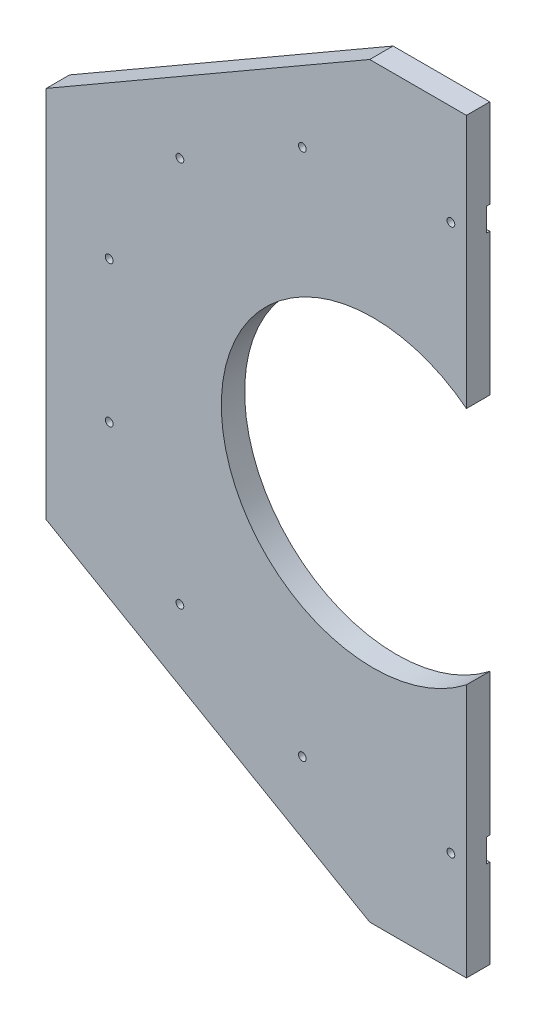
ISO-10303-21;
HEADER;
FILE_DESCRIPTION(('STEP AP214'),'2;1');
FILE_NAME('part.step','',(''),(''),'','','');
FILE_SCHEMA(('AUTOMOTIVE_DESIGN { 1 0 10303 214 1 1 1 1 }'));
ENDSEC;
DATA;
#1=APPLICATION_CONTEXT('core data for automotive mechanical design processes');
#2=APPLICATION_PROTOCOL_DEFINITION('international standard','automotive_design',2000,#1);
#3=PRODUCT_CONTEXT('',#1,'mechanical');
#4=PRODUCT('Part','Part','',(#3));
#5=PRODUCT_RELATED_PRODUCT_CATEGORY('part','',(#4));
#6=PRODUCT_DEFINITION_FORMATION('','',#4);
#7=PRODUCT_DEFINITION_CONTEXT('part definition',#1,'design');
#8=PRODUCT_DEFINITION('design','',#6,#7);
#9=PRODUCT_DEFINITION_SHAPE('','',#8);
#10=(LENGTH_UNIT() NAMED_UNIT(*) SI_UNIT(.MILLI.,.METRE.));
#11=(NAMED_UNIT(*) PLANE_ANGLE_UNIT() SI_UNIT($,.RADIAN.));
#12=(NAMED_UNIT(*) SI_UNIT($,.STERADIAN.) SOLID_ANGLE_UNIT());
#13=UNCERTAINTY_MEASURE_WITH_UNIT(LENGTH_MEASURE(1.E-05),#10,'distance_accuracy_value','');
#14=(GEOMETRIC_REPRESENTATION_CONTEXT(3) GLOBAL_UNCERTAINTY_ASSIGNED_CONTEXT((#13)) GLOBAL_UNIT_ASSIGNED_CONTEXT((#10,
#11,#12)) REPRESENTATION_CONTEXT('',''));
#15=CARTESIAN_POINT('',(0.,0.,0.));
#16=DIRECTION('',(0.,0.,1.));
#17=DIRECTION('',(1.,0.,0.));
#18=AXIS2_PLACEMENT_3D('',#15,#16,#17);
#19=CARTESIAN_POINT('',(0.,0.,0.));
#20=DIRECTION('',(0.,0.,1.));
#21=DIRECTION('',(1.,0.,0.));
#22=AXIS2_PLACEMENT_3D('',#19,#20,#21);
#23=PLANE('',#22);
#24=DIRECTION('',(-0.866025403784439,-0.5,0.));
#25=VECTOR('',#24,1.);
#26=CARTESIAN_POINT('',(-84.4615242270663,146.291651245989,0.));
#27=LINE('',#26,#25);
#28=CARTESIAN_POINT('',(77.8460969082652,240.,0.));
#29=VERTEX_POINT('',#28);
#30=CARTESIAN_POINT('',(-130.,120.,0.));
#31=VERTEX_POINT('',#30);
#32=EDGE_CURVE('E207',#29,#31,#27,.T.);
#33=ORIENTED_EDGE('',*,*,#32,.F.);
#34=DIRECTION('',(-1.,0.,0.));
#35=VECTOR('',#34,1.);
#36=CARTESIAN_POINT('',(0.,240.,0.));
#37=LINE('',#36,#35);
#38=CARTESIAN_POINT('',(140.,240.,0.));
#39=VERTEX_POINT('',#38);
#40=EDGE_CURVE('E187',#39,#29,#37,.T.);
#41=ORIENTED_EDGE('',*,*,#40,.F.);
#42=DIRECTION('',(0.,-1.,0.));
#43=VECTOR('',#42,1.);
#44=CARTESIAN_POINT('',(140.,0.,0.));
#45=LINE('',#44,#43);
#46=CARTESIAN_POINT('',(140.,183.,0.));
#47=VERTEX_POINT('',#46);
#48=EDGE_CURVE('E184',#39,#47,#45,.T.);
#49=ORIENTED_EDGE('',*,*,#48,.T.);
#50=DIRECTION('',(1.,0.,0.));
#51=VECTOR('',#50,1.);
#52=CARTESIAN_POINT('',(0.,183.,0.));
#53=LINE('',#52,#51);
#54=CARTESIAN_POINT('',(79.9999999999999,183.,0.));
#55=VERTEX_POINT('',#54);
#56=EDGE_CURVE('E222',#55,#47,#53,.T.);
#57=ORIENTED_EDGE('',*,*,#56,.F.);
#58=CARTESIAN_POINT('',(79.9999999999999,0.,0.));
#59=DIRECTION('',(0.,0.,1.));
#60=DIRECTION('',(1.,0.,0.));
#61=AXIS2_PLACEMENT_3D('',#58,#59,#60);
#62=CIRCLE('',#61,183.);
#63=CARTESIAN_POINT('',(79.9999999999999,-183.,0.));
#64=VERTEX_POINT('',#63);
#65=EDGE_CURVE('E245',#55,#64,#62,.T.);
#66=ORIENTED_EDGE('',*,*,#65,.T.);
#67=DIRECTION('',(1.,0.,0.));
#68=VECTOR('',#67,1.);
#69=CARTESIAN_POINT('',(0.,-183.,0.));
#70=LINE('',#69,#68);
#71=CARTESIAN_POINT('',(140.,-183.,0.));
#72=VERTEX_POINT('',#71);
#73=EDGE_CURVE('E248',#64,#72,#70,.T.);
#74=ORIENTED_EDGE('',*,*,#73,.T.);
#75=CARTESIAN_POINT('',(140.,-240.,0.));
#76=VERTEX_POINT('',#75);
#77=EDGE_CURVE('E172',#72,#76,#45,.T.);
#78=ORIENTED_EDGE('',*,*,#77,.T.);
#79=DIRECTION('',(-1.,0.,0.));
#80=VECTOR('',#79,1.);
#81=CARTESIAN_POINT('',(0.,-240.,0.));
#82=LINE('',#81,#80);
#83=CARTESIAN_POINT('',(77.8460969082652,-240.,0.));
#84=VERTEX_POINT('',#83);
#85=EDGE_CURVE('E164',#76,#84,#82,.T.);
#86=ORIENTED_EDGE('',*,*,#85,.T.);
#87=DIRECTION('',(0.866025403784439,-0.5,0.));
#88=VECTOR('',#87,1.);
#89=CARTESIAN_POINT('',(-84.4615242270663,-146.291651245989,0.));
#90=LINE('',#89,#88);
#91=CARTESIAN_POINT('',(-130.,-120.,0.));
#92=VERTEX_POINT('',#91);
#93=EDGE_CURVE('E150',#92,#84,#90,.T.);
#94=ORIENTED_EDGE('',*,*,#93,.F.);
#95=DIRECTION('',(0.,-1.,0.));
#96=VECTOR('',#95,1.);
#97=CARTESIAN_POINT('',(-130.,0.,0.));
#98=LINE('',#97,#96);
#99=EDGE_CURVE('E157',#31,#92,#98,.T.);
#100=ORIENTED_EDGE('',*,*,#99,.F.);
#101=EDGE_LOOP('',(#33,#41,#49,#57,#66,#74,#78,#86,#94,#100));
#102=FACE_BOUND('',#101,.T.);
#103=ADVANCED_FACE('F38',(#102),#23,.F.);
#104=CARTESIAN_POINT('',(0.,240.,15.));
#105=DIRECTION('',(0.,-1.,0.));
#106=DIRECTION('',(1.,0.,0.));
#107=AXIS2_PLACEMENT_3D('',#104,#105,#106);
#108=PLANE('',#107);
#109=DIRECTION('',(0.,0.,1.));
#110=VECTOR('',#109,1.);
#111=CARTESIAN_POINT('',(77.8460969082652,240.,-713.625213617524));
#112=LINE('',#111,#110);
#113=CARTESIAN_POINT('',(77.8460969082652,240.,15.));
#114=VERTEX_POINT('',#113);
#115=EDGE_CURVE('E158',#29,#114,#112,.T.);
#116=ORIENTED_EDGE('',*,*,#115,.T.);
#117=DIRECTION('',(-1.,0.,0.));
#118=VECTOR('',#117,1.);
#119=CARTESIAN_POINT('',(0.,240.,15.));
#120=LINE('',#119,#118);
#121=CARTESIAN_POINT('',(140.,240.,15.));
#122=VERTEX_POINT('',#121);
#123=EDGE_CURVE('E182',#122,#114,#120,.T.);
#124=ORIENTED_EDGE('',*,*,#123,.F.);
#125=DIRECTION('',(0.,0.,-1.));
#126=VECTOR('',#125,1.);
#127=CARTESIAN_POINT('',(140.,240.,15.));
#128=LINE('',#127,#126);
#129=EDGE_CURVE('E190',#122,#39,#128,.T.);
#130=ORIENTED_EDGE('',*,*,#129,.T.);
#131=ORIENTED_EDGE('',*,*,#40,.T.);
#132=EDGE_LOOP('',(#116,#124,#130,#131));
#133=FACE_BOUND('',#132,.T.);
#134=ADVANCED_FACE('F318',(#133),#108,.F.);
#135=CARTESIAN_POINT('',(0.,0.,15.));
#136=DIRECTION('',(0.,0.,1.));
#137=DIRECTION('',(1.,0.,0.));
#138=AXIS2_PLACEMENT_3D('',#135,#136,#137);
#139=PLANE('',#138);
#140=CARTESIAN_POINT('',(34.5772575845074,-169.519982513731,15.));
#141=DIRECTION('',(0.,0.,-1.));
#142=DIRECTION('',(-1.,0.,0.));
#143=AXIS2_PLACEMENT_3D('',#140,#141,#142);
#144=CIRCLE('',#143,2.5);
#145=CARTESIAN_POINT('',(32.0772575845074,-169.519982513731,15.));
#146=VERTEX_POINT('',#145);
#147=EDGE_CURVE('E584',#146,#146,#144,.T.);
#148=ORIENTED_EDGE('',*,*,#147,.T.);
#149=EDGE_LOOP('',(#148));
#150=FACE_BOUND('',#149,.T.);
#151=CARTESIAN_POINT('',(-44.0972400982376,-124.097240098241,15.));
#152=DIRECTION('',(0.,0.,-1.));
#153=DIRECTION('',(-1.,0.,0.));
#154=AXIS2_PLACEMENT_3D('',#151,#152,#153);
#155=CIRCLE('',#154,2.5);
#156=CARTESIAN_POINT('',(-46.5972400982376,-124.097240098241,15.));
#157=VERTEX_POINT('',#156);
#158=EDGE_CURVE('E594',#157,#157,#155,.T.);
#159=ORIENTED_EDGE('',*,*,#158,.T.);
#160=EDGE_LOOP('',(#159));
#161=FACE_BOUND('',#160,.T.);
#162=CARTESIAN_POINT('',(-89.5199825137311,-45.4227424154942,15.));
#163=DIRECTION('',(0.,0.,-1.));
#164=DIRECTION('',(-1.,0.,0.));
#165=AXIS2_PLACEMENT_3D('',#162,#163,#164);
#166=CIRCLE('',#165,2.5);
#167=CARTESIAN_POINT('',(-92.0199825137311,-45.4227424154942,15.));
#168=VERTEX_POINT('',#167);
#169=EDGE_CURVE('E600',#168,#168,#166,.T.);
#170=ORIENTED_EDGE('',*,*,#169,.T.);
#171=EDGE_LOOP('',(#170));
#172=FACE_BOUND('',#171,.T.);
#173=CARTESIAN_POINT('',(-89.5199825137319,45.4227424154908,15.));
#174=DIRECTION('',(0.,0.,-1.));
#175=DIRECTION('',(-1.,0.,0.));
#176=AXIS2_PLACEMENT_3D('',#173,#174,#175);
#177=CIRCLE('',#176,2.5);
#178=CARTESIAN_POINT('',(-92.0199825137319,45.4227424154908,15.));
#179=VERTEX_POINT('',#178);
#180=EDGE_CURVE('E606',#179,#179,#177,.T.);
#181=ORIENTED_EDGE('',*,*,#180,.T.);
#182=EDGE_LOOP('',(#181));
#183=FACE_BOUND('',#182,.T.);
#184=CARTESIAN_POINT('',(-44.0972400982401,124.097240098238,15.));
#185=DIRECTION('',(0.,0.,-1.));
#186=DIRECTION('',(-1.,0.,0.));
#187=AXIS2_PLACEMENT_3D('',#184,#185,#186);
#188=CIRCLE('',#187,2.5);
#189=CARTESIAN_POINT('',(-46.5972400982401,124.097240098238,15.));
#190=VERTEX_POINT('',#189);
#191=EDGE_CURVE('E612',#190,#190,#188,.T.);
#192=ORIENTED_EDGE('',*,*,#191,.T.);
#193=EDGE_LOOP('',(#192));
#194=FACE_BOUND('',#193,.T.);
#195=CARTESIAN_POINT('',(34.5772575845063,169.519982513731,15.));
#196=DIRECTION('',(0.,0.,-1.));
#197=DIRECTION('',(-1.,0.,0.));
#198=AXIS2_PLACEMENT_3D('',#195,#196,#197);
#199=CIRCLE('',#198,2.5);
#200=CARTESIAN_POINT('',(32.0772575845063,169.519982513731,15.));
#201=VERTEX_POINT('',#200);
#202=EDGE_CURVE('E618',#201,#201,#199,.T.);
#203=ORIENTED_EDGE('',*,*,#202,.T.);
#204=EDGE_LOOP('',(#203));
#205=FACE_BOUND('',#204,.T.);
#206=CARTESIAN_POINT('',(130.,175.5,15.));
#207=DIRECTION('',(0.,0.,-1.));
#208=DIRECTION('',(-1.,0.,0.));
#209=AXIS2_PLACEMENT_3D('',#206,#207,#208);
#210=CIRCLE('',#209,2.5);
#211=CARTESIAN_POINT('',(127.5,175.5,15.));
#212=VERTEX_POINT('',#211);
#213=EDGE_CURVE('E624',#212,#212,#210,.T.);
#214=ORIENTED_EDGE('',*,*,#213,.T.);
#215=EDGE_LOOP('',(#214));
#216=FACE_BOUND('',#215,.T.);
#217=CARTESIAN_POINT('',(130.,-175.5,15.));
#218=DIRECTION('',(0.,0.,-1.));
#219=DIRECTION('',(-1.,0.,0.));
#220=AXIS2_PLACEMENT_3D('',#217,#218,#219);
#221=CIRCLE('',#220,2.5);
#222=CARTESIAN_POINT('',(127.5,-175.5,15.));
#223=VERTEX_POINT('',#222);
#224=EDGE_CURVE('E167',#223,#223,#221,.T.);
#225=ORIENTED_EDGE('',*,*,#224,.T.);
#226=EDGE_LOOP('',(#225));
#227=FACE_BOUND('',#226,.T.);
#228=ORIENTED_EDGE('',*,*,#123,.T.);
#229=DIRECTION('',(-0.866025403784439,-0.5,0.));
#230=VECTOR('',#229,1.);
#231=CARTESIAN_POINT('',(-84.4615242270663,146.291651245989,15.));
#232=LINE('',#231,#230);
#233=CARTESIAN_POINT('',(-130.,120.,15.));
#234=VERTEX_POINT('',#233);
#235=EDGE_CURVE('E11',#114,#234,#232,.T.);
#236=ORIENTED_EDGE('',*,*,#235,.T.);
#237=DIRECTION('',(0.,-1.,0.));
#238=VECTOR('',#237,1.);
#239=CARTESIAN_POINT('',(-130.,0.,15.));
#240=LINE('',#239,#238);
#241=CARTESIAN_POINT('',(-130.,-120.,15.));
#242=VERTEX_POINT('',#241);
#243=EDGE_CURVE('E46',#234,#242,#240,.T.);
#244=ORIENTED_EDGE('',*,*,#243,.T.);
#245=DIRECTION('',(0.866025403784439,-0.5,0.));
#246=VECTOR('',#245,1.);
#247=CARTESIAN_POINT('',(-84.4615242270663,-146.291651245989,15.));
#248=LINE('',#247,#246);
#249=CARTESIAN_POINT('',(77.8460969082652,-240.,15.));
#250=VERTEX_POINT('',#249);
#251=EDGE_CURVE('E194',#242,#250,#248,.T.);
#252=ORIENTED_EDGE('',*,*,#251,.T.);
#253=DIRECTION('',(-1.,0.,0.));
#254=VECTOR('',#253,1.);
#255=CARTESIAN_POINT('',(0.,-240.,15.));
#256=LINE('',#255,#254);
#257=CARTESIAN_POINT('',(140.,-240.,15.));
#258=VERTEX_POINT('',#257);
#259=EDGE_CURVE('E166',#258,#250,#256,.T.);
#260=ORIENTED_EDGE('',*,*,#259,.F.);
#261=DIRECTION('',(0.,-1.,0.));
#262=VECTOR('',#261,1.);
#263=CARTESIAN_POINT('',(140.,0.,15.));
#264=LINE('',#263,#262);
#265=CARTESIAN_POINT('',(140.,-76.8521307446969,15.));
#266=VERTEX_POINT('',#265);
#267=EDGE_CURVE('E273',#266,#258,#264,.T.);
#268=ORIENTED_EDGE('',*,*,#267,.F.);
#269=CARTESIAN_POINT('',(79.9999999999999,0.,15.));
#270=DIRECTION('',(0.,0.,-1.));
#271=DIRECTION('',(-1.,0.,0.));
#272=AXIS2_PLACEMENT_3D('',#269,#270,#271);
#273=CIRCLE('',#272,97.5);
#274=CARTESIAN_POINT('',(140.,76.8521307446969,15.));
#275=VERTEX_POINT('',#274);
#276=EDGE_CURVE('E215',#266,#275,#273,.T.);
#277=ORIENTED_EDGE('',*,*,#276,.T.);
#278=EDGE_CURVE('E274',#122,#275,#264,.T.);
#279=ORIENTED_EDGE('',*,*,#278,.F.);
#280=EDGE_LOOP('',(#228,#236,#244,#252,#260,#268,#277,#279));
#281=FACE_BOUND('',#280,.T.);
#282=ADVANCED_FACE('F198',(#150,#161,#172,#183,#194,#205,#216,#227,#281),#139,.T.);
#283=CARTESIAN_POINT('',(140.,0.,15.));
#284=DIRECTION('',(1.,0.,0.));
#285=DIRECTION('',(0.,1.,0.));
#286=AXIS2_PLACEMENT_3D('',#283,#284,#285);
#287=PLANE('',#286);
#288=DIRECTION('',(0.,0.,-1.));
#289=VECTOR('',#288,1.);
#290=CARTESIAN_POINT('',(140.,-76.8521307446969,15.));
#291=LINE('',#290,#289);
#292=CARTESIAN_POINT('',(140.,-76.8521307446969,0.));
#293=VERTEX_POINT('',#292);
#294=EDGE_CURVE('E61',#266,#293,#291,.T.);
#295=ORIENTED_EDGE('',*,*,#294,.F.);
#296=ORIENTED_EDGE('',*,*,#267,.T.);
#297=DIRECTION('',(0.,0.,-1.));
#298=VECTOR('',#297,1.);
#299=CARTESIAN_POINT('',(140.,-240.,15.));
#300=LINE('',#299,#298);
#301=EDGE_CURVE('E192',#258,#76,#300,.T.);
#302=ORIENTED_EDGE('',*,*,#301,.T.);
#303=ORIENTED_EDGE('',*,*,#77,.F.);
#304=DIRECTION('',(0.,0.,-1.));
#305=VECTOR('',#304,1.);
#306=CARTESIAN_POINT('',(140.,-183.,2.));
#307=LINE('',#306,#305);
#308=CARTESIAN_POINT('',(140.,-183.,2.));
#309=VERTEX_POINT('',#308);
#310=EDGE_CURVE('E270',#309,#72,#307,.T.);
#311=ORIENTED_EDGE('',*,*,#310,.F.);
#312=DIRECTION('',(0.,-1.,0.));
#313=VECTOR('',#312,1.);
#314=CARTESIAN_POINT('',(140.,0.,2.));
#315=LINE('',#314,#313);
#316=CARTESIAN_POINT('',(140.,-168.,2.));
#317=VERTEX_POINT('',#316);
#318=EDGE_CURVE('E232',#317,#309,#315,.T.);
#319=ORIENTED_EDGE('',*,*,#318,.F.);
#320=DIRECTION('',(0.,0.,-1.));
#321=VECTOR('',#320,1.);
#322=CARTESIAN_POINT('',(140.,-168.,2.));
#323=LINE('',#322,#321);
#324=CARTESIAN_POINT('',(140.,-168.,0.));
#325=VERTEX_POINT('',#324);
#326=EDGE_CURVE('E267',#317,#325,#323,.T.);
#327=ORIENTED_EDGE('',*,*,#326,.T.);
#328=EDGE_CURVE('E176',#293,#325,#45,.T.);
#329=ORIENTED_EDGE('',*,*,#328,.F.);
#330=EDGE_LOOP('',(#295,#296,#302,#303,#311,#319,#327,#329));
#331=FACE_BOUND('',#330,.T.);
#332=ADVANCED_FACE('F280',(#331),#287,.T.);
#333=DIRECTION('',(0.,0.,-1.));
#334=VECTOR('',#333,1.);
#335=CARTESIAN_POINT('',(140.,76.8521307446969,15.));
#336=LINE('',#335,#334);
#337=CARTESIAN_POINT('',(140.,76.8521307446969,0.));
#338=VERTEX_POINT('',#337);
#339=EDGE_CURVE('E219',#275,#338,#336,.T.);
#340=ORIENTED_EDGE('',*,*,#339,.T.);
#341=CARTESIAN_POINT('',(140.,168.,0.));
#342=VERTEX_POINT('',#341);
#343=EDGE_CURVE('E178',#342,#338,#45,.T.);
#344=ORIENTED_EDGE('',*,*,#343,.F.);
#345=DIRECTION('',(0.,0.,-1.));
#346=VECTOR('',#345,1.);
#347=CARTESIAN_POINT('',(140.,168.,2.));
#348=LINE('',#347,#346);
#349=CARTESIAN_POINT('',(140.,168.,2.));
#350=VERTEX_POINT('',#349);
#351=EDGE_CURVE('E261',#350,#342,#348,.T.);
#352=ORIENTED_EDGE('',*,*,#351,.F.);
#353=CARTESIAN_POINT('',(140.,183.,2.));
#354=VERTEX_POINT('',#353);
#355=EDGE_CURVE('E236',#354,#350,#315,.T.);
#356=ORIENTED_EDGE('',*,*,#355,.F.);
#357=DIRECTION('',(0.,0.,-1.));
#358=VECTOR('',#357,1.);
#359=CARTESIAN_POINT('',(140.,183.,2.));
#360=LINE('',#359,#358);
#361=EDGE_CURVE('E258',#354,#47,#360,.T.);
#362=ORIENTED_EDGE('',*,*,#361,.T.);
#363=ORIENTED_EDGE('',*,*,#48,.F.);
#364=ORIENTED_EDGE('',*,*,#129,.F.);
#365=ORIENTED_EDGE('',*,*,#278,.T.);
#366=EDGE_LOOP('',(#340,#344,#352,#356,#362,#363,#364,#365));
#367=FACE_BOUND('',#366,.T.);
#368=ADVANCED_FACE('F285',(#367),#287,.T.);
#369=CARTESIAN_POINT('',(0.,-240.,15.));
#370=DIRECTION('',(0.,-1.,0.));
#371=DIRECTION('',(1.,0.,0.));
#372=AXIS2_PLACEMENT_3D('',#369,#370,#371);
#373=PLANE('',#372);
#374=DIRECTION('',(0.,0.,1.));
#375=VECTOR('',#374,1.);
#376=CARTESIAN_POINT('',(77.8460969082652,-240.,-713.625213617524));
#377=LINE('',#376,#375);
#378=EDGE_CURVE('E53',#84,#250,#377,.T.);
#379=ORIENTED_EDGE('',*,*,#378,.F.);
#380=ORIENTED_EDGE('',*,*,#85,.F.);
#381=ORIENTED_EDGE('',*,*,#301,.F.);
#382=ORIENTED_EDGE('',*,*,#259,.T.);
#383=EDGE_LOOP('',(#379,#380,#381,#382));
#384=FACE_BOUND('',#383,.T.);
#385=ADVANCED_FACE('F40',(#384),#373,.T.);
#386=ORIENTED_EDGE('',*,*,#343,.T.);
#387=CARTESIAN_POINT('',(79.9999999999999,0.,0.));
#388=DIRECTION('',(0.,0.,-1.));
#389=DIRECTION('',(-1.,0.,0.));
#390=AXIS2_PLACEMENT_3D('',#387,#388,#389);
#391=CIRCLE('',#390,97.5);
#392=EDGE_CURVE('E214',#293,#338,#391,.T.);
#393=ORIENTED_EDGE('',*,*,#392,.F.);
#394=ORIENTED_EDGE('',*,*,#328,.T.);
#395=DIRECTION('',(1.,0.,0.));
#396=VECTOR('',#395,1.);
#397=CARTESIAN_POINT('',(0.,-168.,0.));
#398=LINE('',#397,#396);
#399=CARTESIAN_POINT('',(79.9999999999999,-168.,0.));
#400=VERTEX_POINT('',#399);
#401=EDGE_CURVE('E250',#400,#325,#398,.T.);
#402=ORIENTED_EDGE('',*,*,#401,.F.);
#403=CARTESIAN_POINT('',(79.9999999999999,0.,0.));
#404=DIRECTION('',(0.,0.,1.));
#405=DIRECTION('',(1.,0.,0.));
#406=AXIS2_PLACEMENT_3D('',#403,#404,#405);
#407=CIRCLE('',#406,168.);
#408=CARTESIAN_POINT('',(79.9999999999999,168.,0.));
#409=VERTEX_POINT('',#408);
#410=EDGE_CURVE('E253',#409,#400,#407,.T.);
#411=ORIENTED_EDGE('',*,*,#410,.F.);
#412=DIRECTION('',(1.,0.,0.));
#413=VECTOR('',#412,1.);
#414=CARTESIAN_POINT('',(0.,168.,0.));
#415=LINE('',#414,#413);
#416=EDGE_CURVE('E228',#409,#342,#415,.T.);
#417=ORIENTED_EDGE('',*,*,#416,.T.);
#418=EDGE_LOOP('',(#386,#393,#394,#402,#411,#417));
#419=FACE_BOUND('',#418,.T.);
#420=ADVANCED_FACE('F288',(#419),#23,.F.);
#421=CARTESIAN_POINT('',(0.,183.,2.));
#422=DIRECTION('',(0.,1.,0.));
#423=DIRECTION('',(0.,0.,1.));
#424=AXIS2_PLACEMENT_3D('',#421,#422,#423);
#425=PLANE('',#424);
#426=ORIENTED_EDGE('',*,*,#56,.T.);
#427=ORIENTED_EDGE('',*,*,#361,.F.);
#428=DIRECTION('',(1.,0.,0.));
#429=VECTOR('',#428,1.);
#430=CARTESIAN_POINT('',(0.,183.,2.));
#431=LINE('',#430,#429);
#432=CARTESIAN_POINT('',(79.9999999999999,183.,2.));
#433=VERTEX_POINT('',#432);
#434=EDGE_CURVE('E224',#433,#354,#431,.T.);
#435=ORIENTED_EDGE('',*,*,#434,.F.);
#436=DIRECTION('',(0.,0.,-1.));
#437=VECTOR('',#436,1.);
#438=CARTESIAN_POINT('',(79.9999999999999,183.,2.));
#439=LINE('',#438,#437);
#440=EDGE_CURVE('E174',#433,#55,#439,.T.);
#441=ORIENTED_EDGE('',*,*,#440,.T.);
#442=EDGE_LOOP('',(#426,#427,#435,#441));
#443=FACE_BOUND('',#442,.T.);
#444=ADVANCED_FACE('F312',(#443),#425,.F.);
#445=CARTESIAN_POINT('',(79.9999999999999,0.,2.));
#446=DIRECTION('',(0.,0.,-1.));
#447=DIRECTION('',(-1.,0.,0.));
#448=AXIS2_PLACEMENT_3D('',#445,#446,#447);
#449=CYLINDRICAL_SURFACE('',#448,183.);
#450=ORIENTED_EDGE('',*,*,#65,.F.);
#451=ORIENTED_EDGE('',*,*,#440,.F.);
#452=CARTESIAN_POINT('',(79.9999999999999,0.,2.));
#453=DIRECTION('',(0.,0.,1.));
#454=DIRECTION('',(1.,0.,0.));
#455=AXIS2_PLACEMENT_3D('',#452,#453,#454);
#456=CIRCLE('',#455,183.);
#457=CARTESIAN_POINT('',(79.9999999999999,-183.,2.));
#458=VERTEX_POINT('',#457);
#459=EDGE_CURVE('E227',#433,#458,#456,.T.);
#460=ORIENTED_EDGE('',*,*,#459,.T.);
#461=DIRECTION('',(0.,0.,-1.));
#462=VECTOR('',#461,1.);
#463=CARTESIAN_POINT('',(79.9999999999999,-183.,2.));
#464=LINE('',#463,#462);
#465=EDGE_CURVE('E179',#458,#64,#464,.T.);
#466=ORIENTED_EDGE('',*,*,#465,.T.);
#467=EDGE_LOOP('',(#450,#451,#460,#466));
#468=FACE_BOUND('',#467,.T.);
#469=ADVANCED_FACE('F507',(#468),#449,.F.);
#470=CARTESIAN_POINT('',(0.,-183.,2.));
#471=DIRECTION('',(0.,1.,0.));
#472=DIRECTION('',(0.,0.,1.));
#473=AXIS2_PLACEMENT_3D('',#470,#471,#472);
#474=PLANE('',#473);
#475=ORIENTED_EDGE('',*,*,#73,.F.);
#476=ORIENTED_EDGE('',*,*,#465,.F.);
#477=DIRECTION('',(1.,0.,0.));
#478=VECTOR('',#477,1.);
#479=CARTESIAN_POINT('',(0.,-183.,2.));
#480=LINE('',#479,#478);
#481=EDGE_CURVE('E230',#458,#309,#480,.T.);
#482=ORIENTED_EDGE('',*,*,#481,.T.);
#483=ORIENTED_EDGE('',*,*,#310,.T.);
#484=EDGE_LOOP('',(#475,#476,#482,#483));
#485=FACE_BOUND('',#484,.T.);
#486=ADVANCED_FACE('F514',(#485),#474,.T.);
#487=CARTESIAN_POINT('',(0.,-168.,2.));
#488=DIRECTION('',(0.,1.,0.));
#489=DIRECTION('',(0.,0.,1.));
#490=AXIS2_PLACEMENT_3D('',#487,#488,#489);
#491=PLANE('',#490);
#492=ORIENTED_EDGE('',*,*,#401,.T.);
#493=ORIENTED_EDGE('',*,*,#326,.F.);
#494=DIRECTION('',(1.,0.,0.));
#495=VECTOR('',#494,1.);
#496=CARTESIAN_POINT('',(0.,-168.,2.));
#497=LINE('',#496,#495);
#498=CARTESIAN_POINT('',(79.9999999999999,-168.,2.));
#499=VERTEX_POINT('',#498);
#500=EDGE_CURVE('E235',#499,#317,#497,.T.);
#501=ORIENTED_EDGE('',*,*,#500,.F.);
#502=DIRECTION('',(0.,0.,-1.));
#503=VECTOR('',#502,1.);
#504=CARTESIAN_POINT('',(79.9999999999999,-168.,2.));
#505=LINE('',#504,#503);
#506=EDGE_CURVE('E265',#499,#400,#505,.T.);
#507=ORIENTED_EDGE('',*,*,#506,.T.);
#508=EDGE_LOOP('',(#492,#493,#501,#507));
#509=FACE_BOUND('',#508,.T.);
#510=ADVANCED_FACE('F293',(#509),#491,.F.);
#511=CARTESIAN_POINT('',(79.9999999999999,0.,2.));
#512=DIRECTION('',(0.,0.,-1.));
#513=DIRECTION('',(-1.,0.,0.));
#514=AXIS2_PLACEMENT_3D('',#511,#512,#513);
#515=CYLINDRICAL_SURFACE('',#514,168.);
#516=ORIENTED_EDGE('',*,*,#410,.T.);
#517=ORIENTED_EDGE('',*,*,#506,.F.);
#518=CARTESIAN_POINT('',(79.9999999999999,0.,2.));
#519=DIRECTION('',(0.,0.,1.));
#520=DIRECTION('',(1.,0.,0.));
#521=AXIS2_PLACEMENT_3D('',#518,#519,#520);
#522=CIRCLE('',#521,168.);
#523=CARTESIAN_POINT('',(79.9999999999999,168.,2.));
#524=VERTEX_POINT('',#523);
#525=EDGE_CURVE('E239',#524,#499,#522,.T.);
#526=ORIENTED_EDGE('',*,*,#525,.F.);
#527=DIRECTION('',(0.,0.,-1.));
#528=VECTOR('',#527,1.);
#529=CARTESIAN_POINT('',(79.9999999999999,168.,2.));
#530=LINE('',#529,#528);
#531=EDGE_CURVE('E263',#524,#409,#530,.T.);
#532=ORIENTED_EDGE('',*,*,#531,.T.);
#533=EDGE_LOOP('',(#516,#517,#526,#532));
#534=FACE_BOUND('',#533,.T.);
#535=ADVANCED_FACE('F305',(#534),#515,.T.);
#536=CARTESIAN_POINT('',(0.,168.,2.));
#537=DIRECTION('',(0.,1.,0.));
#538=DIRECTION('',(0.,0.,1.));
#539=AXIS2_PLACEMENT_3D('',#536,#537,#538);
#540=PLANE('',#539);
#541=ORIENTED_EDGE('',*,*,#416,.F.);
#542=ORIENTED_EDGE('',*,*,#531,.F.);
#543=DIRECTION('',(1.,0.,0.));
#544=VECTOR('',#543,1.);
#545=CARTESIAN_POINT('',(0.,168.,2.));
#546=LINE('',#545,#544);
#547=EDGE_CURVE('E242',#524,#350,#546,.T.);
#548=ORIENTED_EDGE('',*,*,#547,.T.);
#549=ORIENTED_EDGE('',*,*,#351,.T.);
#550=EDGE_LOOP('',(#541,#542,#548,#549));
#551=FACE_BOUND('',#550,.T.);
#552=ADVANCED_FACE('F307',(#551),#540,.T.);
#553=CARTESIAN_POINT('',(0.,0.,2.));
#554=DIRECTION('',(0.,0.,1.));
#555=DIRECTION('',(1.,0.,0.));
#556=AXIS2_PLACEMENT_3D('',#553,#554,#555);
#557=PLANE('',#556);
#558=CARTESIAN_POINT('',(34.5772575845074,-169.519982513731,2.));
#559=DIRECTION('',(0.,0.,-1.));
#560=DIRECTION('',(-1.,0.,0.));
#561=AXIS2_PLACEMENT_3D('',#558,#559,#560);
#562=CIRCLE('',#561,2.5);
#563=CARTESIAN_POINT('',(32.0772575845074,-169.519982513731,2.));
#564=VERTEX_POINT('',#563);
#565=EDGE_CURVE('E587',#564,#564,#562,.T.);
#566=ORIENTED_EDGE('',*,*,#565,.F.);
#567=EDGE_LOOP('',(#566));
#568=FACE_BOUND('',#567,.T.);
#569=CARTESIAN_POINT('',(-44.0972400982376,-124.097240098241,2.));
#570=DIRECTION('',(0.,0.,-1.));
#571=DIRECTION('',(-1.,0.,0.));
#572=AXIS2_PLACEMENT_3D('',#569,#570,#571);
#573=CIRCLE('',#572,2.5);
#574=CARTESIAN_POINT('',(-46.5972400982377,-124.097240098241,2.));
#575=VERTEX_POINT('',#574);
#576=EDGE_CURVE('E589',#575,#575,#573,.T.);
#577=ORIENTED_EDGE('',*,*,#576,.F.);
#578=EDGE_LOOP('',(#577));
#579=FACE_BOUND('',#578,.T.);
#580=CARTESIAN_POINT('',(-89.5199825137311,-45.4227424154942,2.));
#581=DIRECTION('',(0.,0.,-1.));
#582=DIRECTION('',(-1.,0.,0.));
#583=AXIS2_PLACEMENT_3D('',#580,#581,#582);
#584=CIRCLE('',#583,2.5);
#585=CARTESIAN_POINT('',(-92.0199825137311,-45.4227424154942,2.));
#586=VERTEX_POINT('',#585);
#587=EDGE_CURVE('E597',#586,#586,#584,.T.);
#588=ORIENTED_EDGE('',*,*,#587,.F.);
#589=EDGE_LOOP('',(#588));
#590=FACE_BOUND('',#589,.T.);
#591=CARTESIAN_POINT('',(-89.5199825137319,45.4227424154908,2.));
#592=DIRECTION('',(0.,0.,-1.));
#593=DIRECTION('',(-1.,0.,0.));
#594=AXIS2_PLACEMENT_3D('',#591,#592,#593);
#595=CIRCLE('',#594,2.5);
#596=CARTESIAN_POINT('',(-92.0199825137319,45.4227424154908,2.));
#597=VERTEX_POINT('',#596);
#598=EDGE_CURVE('E603',#597,#597,#595,.T.);
#599=ORIENTED_EDGE('',*,*,#598,.F.);
#600=EDGE_LOOP('',(#599));
#601=FACE_BOUND('',#600,.T.);
#602=CARTESIAN_POINT('',(-44.0972400982401,124.097240098238,2.));
#603=DIRECTION('',(0.,0.,-1.));
#604=DIRECTION('',(-1.,0.,0.));
#605=AXIS2_PLACEMENT_3D('',#602,#603,#604);
#606=CIRCLE('',#605,2.5);
#607=CARTESIAN_POINT('',(-46.5972400982401,124.097240098238,2.));
#608=VERTEX_POINT('',#607);
#609=EDGE_CURVE('E609',#608,#608,#606,.T.);
#610=ORIENTED_EDGE('',*,*,#609,.F.);
#611=EDGE_LOOP('',(#610));
#612=FACE_BOUND('',#611,.T.);
#613=CARTESIAN_POINT('',(34.5772575845063,169.519982513731,2.));
#614=DIRECTION('',(0.,0.,-1.));
#615=DIRECTION('',(-1.,0.,0.));
#616=AXIS2_PLACEMENT_3D('',#613,#614,#615);
#617=CIRCLE('',#616,2.5);
#618=CARTESIAN_POINT('',(32.0772575845063,169.519982513731,2.));
#619=VERTEX_POINT('',#618);
#620=EDGE_CURVE('E615',#619,#619,#617,.T.);
#621=ORIENTED_EDGE('',*,*,#620,.F.);
#622=EDGE_LOOP('',(#621));
#623=FACE_BOUND('',#622,.T.);
#624=CARTESIAN_POINT('',(130.,175.5,2.));
#625=DIRECTION('',(0.,0.,-1.));
#626=DIRECTION('',(-1.,0.,0.));
#627=AXIS2_PLACEMENT_3D('',#624,#625,#626);
#628=CIRCLE('',#627,2.5);
#629=CARTESIAN_POINT('',(127.5,175.5,2.));
#630=VERTEX_POINT('',#629);
#631=EDGE_CURVE('E621',#630,#630,#628,.T.);
#632=ORIENTED_EDGE('',*,*,#631,.F.);
#633=EDGE_LOOP('',(#632));
#634=FACE_BOUND('',#633,.T.);
#635=CARTESIAN_POINT('',(130.,-175.5,2.));
#636=DIRECTION('',(0.,0.,-1.));
#637=DIRECTION('',(-1.,0.,0.));
#638=AXIS2_PLACEMENT_3D('',#635,#636,#637);
#639=CIRCLE('',#638,2.5);
#640=CARTESIAN_POINT('',(127.5,-175.5,2.));
#641=VERTEX_POINT('',#640);
#642=EDGE_CURVE('E627',#641,#641,#639,.T.);
#643=ORIENTED_EDGE('',*,*,#642,.F.);
#644=EDGE_LOOP('',(#643));
#645=FACE_BOUND('',#644,.T.);
#646=ORIENTED_EDGE('',*,*,#434,.T.);
#647=ORIENTED_EDGE('',*,*,#355,.T.);
#648=ORIENTED_EDGE('',*,*,#547,.F.);
#649=ORIENTED_EDGE('',*,*,#525,.T.);
#650=ORIENTED_EDGE('',*,*,#500,.T.);
#651=ORIENTED_EDGE('',*,*,#318,.T.);
#652=ORIENTED_EDGE('',*,*,#481,.F.);
#653=ORIENTED_EDGE('',*,*,#459,.F.);
#654=EDGE_LOOP('',(#646,#647,#648,#649,#650,#651,#652,#653));
#655=FACE_BOUND('',#654,.T.);
#656=ADVANCED_FACE('F299',(#568,#579,#590,#601,#612,#623,#634,#645,#655),#557,.F.);
#657=CARTESIAN_POINT('',(79.9999999999999,0.,15.));
#658=DIRECTION('',(0.,0.,-1.));
#659=DIRECTION('',(-1.,0.,0.));
#660=AXIS2_PLACEMENT_3D('',#657,#658,#659);
#661=CYLINDRICAL_SURFACE('',#660,97.5);
#662=ORIENTED_EDGE('',*,*,#392,.T.);
#663=ORIENTED_EDGE('',*,*,#339,.F.);
#664=ORIENTED_EDGE('',*,*,#276,.F.);
#665=ORIENTED_EDGE('',*,*,#294,.T.);
#666=EDGE_LOOP('',(#662,#663,#664,#665));
#667=FACE_BOUND('',#666,.T.);
#668=ADVANCED_FACE('F282',(#667),#661,.F.);
#669=CARTESIAN_POINT('',(77.8460969082652,240.,-713.625213617524));
#670=DIRECTION('',(-0.5,0.866025403784439,0.));
#671=DIRECTION('',(-0.866025403784439,-0.5,0.));
#672=AXIS2_PLACEMENT_3D('',#669,#670,#671);
#673=PLANE('',#672);
#674=ORIENTED_EDGE('',*,*,#115,.F.);
#675=ORIENTED_EDGE('',*,*,#32,.T.);
#676=DIRECTION('',(0.,0.,1.));
#677=VECTOR('',#676,1.);
#678=CARTESIAN_POINT('',(-130.,120.,-713.625213617524));
#679=LINE('',#678,#677);
#680=EDGE_CURVE('E203',#31,#234,#679,.T.);
#681=ORIENTED_EDGE('',*,*,#680,.T.);
#682=ORIENTED_EDGE('',*,*,#235,.F.);
#683=EDGE_LOOP('',(#674,#675,#681,#682));
#684=FACE_BOUND('',#683,.T.);
#685=ADVANCED_FACE('F205',(#684),#673,.T.);
#686=CARTESIAN_POINT('',(-130.,120.,-713.625213617524));
#687=DIRECTION('',(-1.,0.,0.));
#688=DIRECTION('',(0.,0.,1.));
#689=AXIS2_PLACEMENT_3D('',#686,#687,#688);
#690=PLANE('',#689);
#691=ORIENTED_EDGE('',*,*,#680,.F.);
#692=ORIENTED_EDGE('',*,*,#99,.T.);
#693=DIRECTION('',(0.,0.,1.));
#694=VECTOR('',#693,1.);
#695=CARTESIAN_POINT('',(-130.,-120.,-713.625213617524));
#696=LINE('',#695,#694);
#697=EDGE_CURVE('E153',#92,#242,#696,.T.);
#698=ORIENTED_EDGE('',*,*,#697,.T.);
#699=ORIENTED_EDGE('',*,*,#243,.F.);
#700=EDGE_LOOP('',(#691,#692,#698,#699));
#701=FACE_BOUND('',#700,.T.);
#702=ADVANCED_FACE('F202',(#701),#690,.T.);
#703=CARTESIAN_POINT('',(-130.,-120.,-713.625213617524));
#704=DIRECTION('',(-0.5,-0.866025403784439,0.));
#705=DIRECTION('',(0.866025403784439,-0.5,0.));
#706=AXIS2_PLACEMENT_3D('',#703,#704,#705);
#707=PLANE('',#706);
#708=ORIENTED_EDGE('',*,*,#697,.F.);
#709=ORIENTED_EDGE('',*,*,#93,.T.);
#710=ORIENTED_EDGE('',*,*,#378,.T.);
#711=ORIENTED_EDGE('',*,*,#251,.F.);
#712=EDGE_LOOP('',(#708,#709,#710,#711));
#713=FACE_BOUND('',#712,.T.);
#714=ADVANCED_FACE('F151',(#713),#707,.T.);
#715=CARTESIAN_POINT('',(130.,-175.5,2.));
#716=DIRECTION('',(0.,0.,-1.));
#717=DIRECTION('',(-1.,0.,0.));
#718=AXIS2_PLACEMENT_3D('',#715,#716,#717);
#719=CYLINDRICAL_SURFACE('',#718,2.5);
#720=ORIENTED_EDGE('',*,*,#224,.F.);
#721=EDGE_LOOP('',(#720));
#722=FACE_BOUND('',#721,.T.);
#723=ORIENTED_EDGE('',*,*,#642,.T.);
#724=EDGE_LOOP('',(#723));
#725=FACE_BOUND('',#724,.T.);
#726=ADVANCED_FACE('F364',(#722,#725),#719,.F.);
#727=CARTESIAN_POINT('',(130.,175.5,2.));
#728=DIRECTION('',(0.,0.,-1.));
#729=DIRECTION('',(-1.,0.,0.));
#730=AXIS2_PLACEMENT_3D('',#727,#728,#729);
#731=CYLINDRICAL_SURFACE('',#730,2.5);
#732=ORIENTED_EDGE('',*,*,#213,.F.);
#733=EDGE_LOOP('',(#732));
#734=FACE_BOUND('',#733,.T.);
#735=ORIENTED_EDGE('',*,*,#631,.T.);
#736=EDGE_LOOP('',(#735));
#737=FACE_BOUND('',#736,.T.);
#738=ADVANCED_FACE('F370',(#734,#737),#731,.F.);
#739=CARTESIAN_POINT('',(34.5772575845063,169.519982513731,2.));
#740=DIRECTION('',(0.,0.,-1.));
#741=DIRECTION('',(-1.,0.,0.));
#742=AXIS2_PLACEMENT_3D('',#739,#740,#741);
#743=CYLINDRICAL_SURFACE('',#742,2.5);
#744=ORIENTED_EDGE('',*,*,#202,.F.);
#745=EDGE_LOOP('',(#744));
#746=FACE_BOUND('',#745,.T.);
#747=ORIENTED_EDGE('',*,*,#620,.T.);
#748=EDGE_LOOP('',(#747));
#749=FACE_BOUND('',#748,.T.);
#750=ADVANCED_FACE('F382',(#746,#749),#743,.F.);
#751=CARTESIAN_POINT('',(-44.0972400982401,124.097240098238,2.));
#752=DIRECTION('',(0.,0.,-1.));
#753=DIRECTION('',(-1.,0.,0.));
#754=AXIS2_PLACEMENT_3D('',#751,#752,#753);
#755=CYLINDRICAL_SURFACE('',#754,2.5);
#756=ORIENTED_EDGE('',*,*,#191,.F.);
#757=EDGE_LOOP('',(#756));
#758=FACE_BOUND('',#757,.T.);
#759=ORIENTED_EDGE('',*,*,#609,.T.);
#760=EDGE_LOOP('',(#759));
#761=FACE_BOUND('',#760,.T.);
#762=ADVANCED_FACE('F392',(#758,#761),#755,.F.);
#763=CARTESIAN_POINT('',(-89.5199825137319,45.4227424154908,2.));
#764=DIRECTION('',(0.,0.,-1.));
#765=DIRECTION('',(-1.,0.,0.));
#766=AXIS2_PLACEMENT_3D('',#763,#764,#765);
#767=CYLINDRICAL_SURFACE('',#766,2.5);
#768=ORIENTED_EDGE('',*,*,#180,.F.);
#769=EDGE_LOOP('',(#768));
#770=FACE_BOUND('',#769,.T.);
#771=ORIENTED_EDGE('',*,*,#598,.T.);
#772=EDGE_LOOP('',(#771));
#773=FACE_BOUND('',#772,.T.);
#774=ADVANCED_FACE('F403',(#770,#773),#767,.F.);
#775=CARTESIAN_POINT('',(-89.5199825137311,-45.4227424154942,2.));
#776=DIRECTION('',(0.,0.,-1.));
#777=DIRECTION('',(-1.,0.,0.));
#778=AXIS2_PLACEMENT_3D('',#775,#776,#777);
#779=CYLINDRICAL_SURFACE('',#778,2.5);
#780=ORIENTED_EDGE('',*,*,#169,.F.);
#781=EDGE_LOOP('',(#780));
#782=FACE_BOUND('',#781,.T.);
#783=ORIENTED_EDGE('',*,*,#587,.T.);
#784=EDGE_LOOP('',(#783));
#785=FACE_BOUND('',#784,.T.);
#786=ADVANCED_FACE('F414',(#782,#785),#779,.F.);
#787=CARTESIAN_POINT('',(-44.0972400982376,-124.097240098241,2.));
#788=DIRECTION('',(0.,0.,-1.));
#789=DIRECTION('',(-1.,0.,0.));
#790=AXIS2_PLACEMENT_3D('',#787,#788,#789);
#791=CYLINDRICAL_SURFACE('',#790,2.5);
#792=ORIENTED_EDGE('',*,*,#158,.F.);
#793=EDGE_LOOP('',(#792));
#794=FACE_BOUND('',#793,.T.);
#795=ORIENTED_EDGE('',*,*,#576,.T.);
#796=EDGE_LOOP('',(#795));
#797=FACE_BOUND('',#796,.T.);
#798=ADVANCED_FACE('F425',(#794,#797),#791,.F.);
#799=CARTESIAN_POINT('',(34.5772575845074,-169.519982513731,2.));
#800=DIRECTION('',(0.,0.,-1.));
#801=DIRECTION('',(-1.,0.,0.));
#802=AXIS2_PLACEMENT_3D('',#799,#800,#801);
#803=CYLINDRICAL_SURFACE('',#802,2.5);
#804=ORIENTED_EDGE('',*,*,#147,.F.);
#805=EDGE_LOOP('',(#804));
#806=FACE_BOUND('',#805,.T.);
#807=ORIENTED_EDGE('',*,*,#565,.T.);
#808=EDGE_LOOP('',(#807));
#809=FACE_BOUND('',#808,.T.);
#810=ADVANCED_FACE('F436',(#806,#809),#803,.F.);
#811=CLOSED_SHELL('',(#103,#134,#282,#332,#368,#385,#420,#444,#469,#486,#510,#535,#552,#656,
#668,#685,#702,#714,#726,#738,#750,#762,#774,#786,#798,#810));
#812=MANIFOLD_SOLID_BREP('B2',#811);
#813=ADVANCED_BREP_SHAPE_REPRESENTATION('',(#18,#812),#14);
#814=SHAPE_DEFINITION_REPRESENTATION(#9,#813);
ENDSEC;
END-ISO-10303-21;
